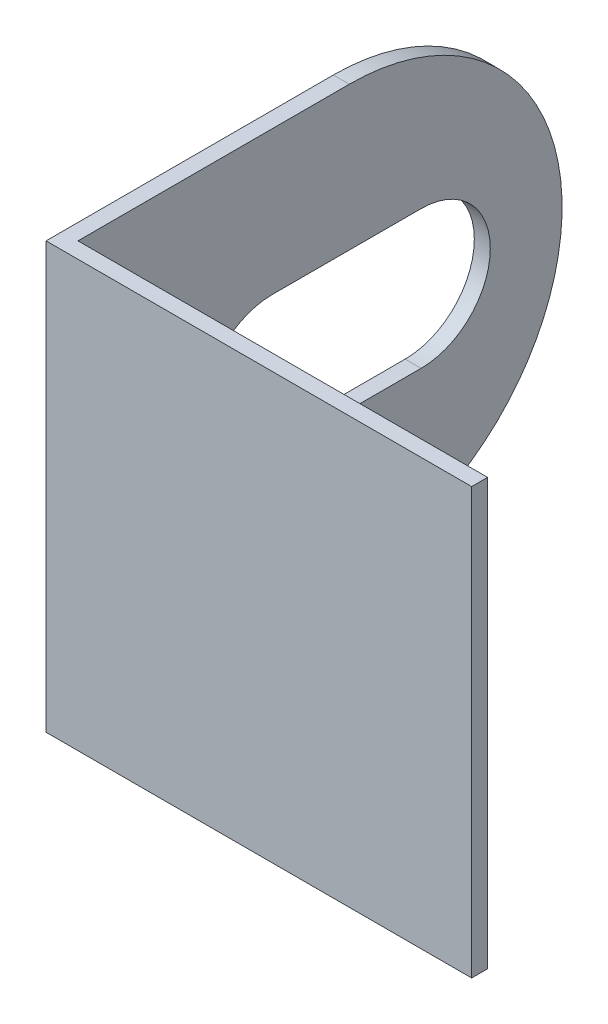
ISO-10303-21;
HEADER;
FILE_DESCRIPTION(('STEP AP214'),'2;1');
FILE_NAME('part.step','',(''),(''),'','','');
FILE_SCHEMA(('AUTOMOTIVE_DESIGN { 1 0 10303 214 1 1 1 1 }'));
ENDSEC;
DATA;
#1=APPLICATION_CONTEXT('core data for automotive mechanical design processes');
#2=APPLICATION_PROTOCOL_DEFINITION('international standard','automotive_design',2000,#1);
#3=PRODUCT_CONTEXT('',#1,'mechanical');
#4=PRODUCT('Part','Part','',(#3));
#5=PRODUCT_RELATED_PRODUCT_CATEGORY('part','',(#4));
#6=PRODUCT_DEFINITION_FORMATION('','',#4);
#7=PRODUCT_DEFINITION_CONTEXT('part definition',#1,'design');
#8=PRODUCT_DEFINITION('design','',#6,#7);
#9=PRODUCT_DEFINITION_SHAPE('','',#8);
#10=(LENGTH_UNIT() NAMED_UNIT(*) SI_UNIT(.MILLI.,.METRE.));
#11=(NAMED_UNIT(*) PLANE_ANGLE_UNIT() SI_UNIT($,.RADIAN.));
#12=(NAMED_UNIT(*) SI_UNIT($,.STERADIAN.) SOLID_ANGLE_UNIT());
#13=UNCERTAINTY_MEASURE_WITH_UNIT(LENGTH_MEASURE(1.E-05),#10,'distance_accuracy_value','');
#14=(GEOMETRIC_REPRESENTATION_CONTEXT(3) GLOBAL_UNCERTAINTY_ASSIGNED_CONTEXT((#13)) GLOBAL_UNIT_ASSIGNED_CONTEXT((#10,
#11,#12)) REPRESENTATION_CONTEXT('',''));
#15=CARTESIAN_POINT('',(0.,0.,0.));
#16=DIRECTION('',(0.,0.,1.));
#17=DIRECTION('',(1.,0.,0.));
#18=AXIS2_PLACEMENT_3D('',#15,#16,#17);
#19=CARTESIAN_POINT('',(-20.,40.,23.5));
#20=DIRECTION('',(1.,0.,0.));
#21=DIRECTION('',(0.,0.,-1.));
#22=AXIS2_PLACEMENT_3D('',#19,#20,#21);
#23=PLANE('',#22);
#24=CARTESIAN_POINT('',(-20.,20.,3.75));
#25=DIRECTION('',(-1.,0.,0.));
#26=DIRECTION('',(0.,0.,1.));
#27=AXIS2_PLACEMENT_3D('',#24,#25,#26);
#28=CIRCLE('',#27,6.5);
#29=CARTESIAN_POINT('',(-20.,13.5,3.75));
#30=VERTEX_POINT('',#29);
#31=CARTESIAN_POINT('',(-20.,26.5,3.75));
#32=VERTEX_POINT('',#31);
#33=EDGE_CURVE('E195',#30,#32,#28,.T.);
#34=ORIENTED_EDGE('',*,*,#33,.F.);
#35=DIRECTION('',(0.,0.,1.));
#36=VECTOR('',#35,1.);
#37=CARTESIAN_POINT('',(-20.,13.5,0.));
#38=LINE('',#37,#36);
#39=CARTESIAN_POINT('',(-20.,13.5,-10.25));
#40=VERTEX_POINT('',#39);
#41=EDGE_CURVE('E120',#40,#30,#38,.T.);
#42=ORIENTED_EDGE('',*,*,#41,.F.);
#43=CARTESIAN_POINT('',(-20.,20.,-10.25));
#44=DIRECTION('',(-1.,0.,0.));
#45=DIRECTION('',(0.,0.,1.));
#46=AXIS2_PLACEMENT_3D('',#43,#44,#45);
#47=CIRCLE('',#46,6.5);
#48=CARTESIAN_POINT('',(-20.,26.5,-10.25));
#49=VERTEX_POINT('',#48);
#50=EDGE_CURVE('E202',#49,#40,#47,.T.);
#51=ORIENTED_EDGE('',*,*,#50,.F.);
#52=DIRECTION('',(0.,0.,1.));
#53=VECTOR('',#52,1.);
#54=CARTESIAN_POINT('',(-20.,26.5,0.));
#55=LINE('',#54,#53);
#56=EDGE_CURVE('E185',#49,#32,#55,.T.);
#57=ORIENTED_EDGE('',*,*,#56,.T.);
#58=EDGE_LOOP('',(#34,#42,#51,#57));
#59=FACE_BOUND('',#58,.T.);
#60=DIRECTION('',(0.,0.,1.));
#61=VECTOR('',#60,1.);
#62=CARTESIAN_POINT('',(-20.,40.,23.5));
#63=LINE('',#62,#61);
#64=CARTESIAN_POINT('',(-20.,40.,-3.5));
#65=VERTEX_POINT('',#64);
#66=CARTESIAN_POINT('',(-20.,40.,23.5));
#67=VERTEX_POINT('',#66);
#68=EDGE_CURVE('E224',#65,#67,#63,.T.);
#69=ORIENTED_EDGE('',*,*,#68,.F.);
#70=CARTESIAN_POINT('',(-20.,20.,-3.5));
#71=DIRECTION('',(-1.,0.,0.));
#72=DIRECTION('',(0.,0.,1.));
#73=AXIS2_PLACEMENT_3D('',#70,#71,#72);
#74=CIRCLE('',#73,20.);
#75=CARTESIAN_POINT('',(-20.,0.,-3.5));
#76=VERTEX_POINT('',#75);
#77=EDGE_CURVE('E212',#65,#76,#74,.T.);
#78=ORIENTED_EDGE('',*,*,#77,.T.);
#79=DIRECTION('',(0.,0.,1.));
#80=VECTOR('',#79,1.);
#81=CARTESIAN_POINT('',(-20.,0.,23.5));
#82=LINE('',#81,#80);
#83=CARTESIAN_POINT('',(-20.,0.,23.5));
#84=VERTEX_POINT('',#83);
#85=EDGE_CURVE('E223',#76,#84,#82,.T.);
#86=ORIENTED_EDGE('',*,*,#85,.T.);
#87=DIRECTION('',(0.,-1.,0.));
#88=VECTOR('',#87,1.);
#89=CARTESIAN_POINT('',(-20.,40.,23.5));
#90=LINE('',#89,#88);
#91=EDGE_CURVE('E267',#67,#84,#90,.T.);
#92=ORIENTED_EDGE('',*,*,#91,.F.);
#93=EDGE_LOOP('',(#69,#78,#86,#92));
#94=FACE_BOUND('',#93,.T.);
#95=ADVANCED_FACE('F105',(#59,#94),#23,.F.);
#96=CARTESIAN_POINT('',(-18.5,40.,-23.5));
#97=DIRECTION('',(-1.,0.,0.));
#98=DIRECTION('',(0.,0.,1.));
#99=AXIS2_PLACEMENT_3D('',#96,#97,#98);
#100=PLANE('',#99);
#101=CARTESIAN_POINT('',(-18.5,20.,-10.25));
#102=DIRECTION('',(-1.,0.,0.));
#103=DIRECTION('',(0.,0.,1.));
#104=AXIS2_PLACEMENT_3D('',#101,#102,#103);
#105=CIRCLE('',#104,6.5);
#106=CARTESIAN_POINT('',(-18.5,26.5,-10.25));
#107=VERTEX_POINT('',#106);
#108=CARTESIAN_POINT('',(-18.5,13.5,-10.25));
#109=VERTEX_POINT('',#108);
#110=EDGE_CURVE('E113',#107,#109,#105,.T.);
#111=ORIENTED_EDGE('',*,*,#110,.T.);
#112=DIRECTION('',(0.,0.,1.));
#113=VECTOR('',#112,1.);
#114=CARTESIAN_POINT('',(-18.5,13.5,-23.5));
#115=LINE('',#114,#113);
#116=CARTESIAN_POINT('',(-18.5,13.5,3.75));
#117=VERTEX_POINT('',#116);
#118=EDGE_CURVE('E12',#109,#117,#115,.T.);
#119=ORIENTED_EDGE('',*,*,#118,.T.);
#120=CARTESIAN_POINT('',(-18.5,20.,3.75));
#121=DIRECTION('',(-1.,0.,0.));
#122=DIRECTION('',(0.,0.,1.));
#123=AXIS2_PLACEMENT_3D('',#120,#121,#122);
#124=CIRCLE('',#123,6.5);
#125=CARTESIAN_POINT('',(-18.5,26.5,3.75));
#126=VERTEX_POINT('',#125);
#127=EDGE_CURVE('E278',#117,#126,#124,.T.);
#128=ORIENTED_EDGE('',*,*,#127,.T.);
#129=DIRECTION('',(0.,0.,1.));
#130=VECTOR('',#129,1.);
#131=CARTESIAN_POINT('',(-18.5,26.5,-23.5));
#132=LINE('',#131,#130);
#133=EDGE_CURVE('E188',#107,#126,#132,.T.);
#134=ORIENTED_EDGE('',*,*,#133,.F.);
#135=EDGE_LOOP('',(#111,#119,#128,#134));
#136=FACE_BOUND('',#135,.T.);
#137=CARTESIAN_POINT('',(-18.5,20.,-3.5));
#138=DIRECTION('',(-1.,0.,0.));
#139=DIRECTION('',(0.,0.,1.));
#140=AXIS2_PLACEMENT_3D('',#137,#138,#139);
#141=CIRCLE('',#140,20.);
#142=CARTESIAN_POINT('',(-18.5,40.,-3.5));
#143=VERTEX_POINT('',#142);
#144=CARTESIAN_POINT('',(-18.5,0.,-3.5));
#145=VERTEX_POINT('',#144);
#146=EDGE_CURVE('E220',#143,#145,#141,.T.);
#147=ORIENTED_EDGE('',*,*,#146,.F.);
#148=DIRECTION('',(0.,0.,-1.));
#149=VECTOR('',#148,1.);
#150=CARTESIAN_POINT('',(-18.5,40.,-23.5));
#151=LINE('',#150,#149);
#152=CARTESIAN_POINT('',(-18.5,40.,22.));
#153=VERTEX_POINT('',#152);
#154=EDGE_CURVE('E237',#153,#143,#151,.T.);
#155=ORIENTED_EDGE('',*,*,#154,.F.);
#156=DIRECTION('',(0.,-1.,0.));
#157=VECTOR('',#156,1.);
#158=CARTESIAN_POINT('',(-18.5,40.,22.));
#159=LINE('',#158,#157);
#160=CARTESIAN_POINT('',(-18.5,0.,22.));
#161=VERTEX_POINT('',#160);
#162=EDGE_CURVE('E241',#153,#161,#159,.T.);
#163=ORIENTED_EDGE('',*,*,#162,.T.);
#164=DIRECTION('',(0.,0.,-1.));
#165=VECTOR('',#164,1.);
#166=CARTESIAN_POINT('',(-18.5,0.,-23.5));
#167=LINE('',#166,#165);
#168=EDGE_CURVE('E228',#161,#145,#167,.T.);
#169=ORIENTED_EDGE('',*,*,#168,.T.);
#170=EDGE_LOOP('',(#147,#155,#163,#169));
#171=FACE_BOUND('',#170,.T.);
#172=ADVANCED_FACE('F285',(#136,#171),#100,.F.);
#173=CARTESIAN_POINT('',(20.,40.,23.5));
#174=DIRECTION('',(0.,0.,-1.));
#175=DIRECTION('',(-1.,0.,0.));
#176=AXIS2_PLACEMENT_3D('',#173,#174,#175);
#177=PLANE('',#176);
#178=DIRECTION('',(1.,0.,0.));
#179=VECTOR('',#178,1.);
#180=CARTESIAN_POINT('',(20.,0.,23.5));
#181=LINE('',#180,#179);
#182=CARTESIAN_POINT('',(20.,0.,23.5));
#183=VERTEX_POINT('',#182);
#184=EDGE_CURVE('E244',#84,#183,#181,.T.);
#185=ORIENTED_EDGE('',*,*,#184,.T.);
#186=DIRECTION('',(0.,-1.,0.));
#187=VECTOR('',#186,1.);
#188=CARTESIAN_POINT('',(20.,40.,23.5));
#189=LINE('',#188,#187);
#190=CARTESIAN_POINT('',(20.,40.,23.5));
#191=VERTEX_POINT('',#190);
#192=EDGE_CURVE('E263',#191,#183,#189,.T.);
#193=ORIENTED_EDGE('',*,*,#192,.F.);
#194=DIRECTION('',(1.,0.,0.));
#195=VECTOR('',#194,1.);
#196=CARTESIAN_POINT('',(20.,40.,23.5));
#197=LINE('',#196,#195);
#198=EDGE_CURVE('E227',#67,#191,#197,.T.);
#199=ORIENTED_EDGE('',*,*,#198,.F.);
#200=ORIENTED_EDGE('',*,*,#91,.T.);
#201=EDGE_LOOP('',(#185,#193,#199,#200));
#202=FACE_BOUND('',#201,.T.);
#203=ADVANCED_FACE('F308',(#202),#177,.F.);
#204=CARTESIAN_POINT('',(20.,40.,22.));
#205=DIRECTION('',(-1.,0.,0.));
#206=DIRECTION('',(0.,0.,1.));
#207=AXIS2_PLACEMENT_3D('',#204,#205,#206);
#208=PLANE('',#207);
#209=DIRECTION('',(0.,0.,-1.));
#210=VECTOR('',#209,1.);
#211=CARTESIAN_POINT('',(20.,0.,22.));
#212=LINE('',#211,#210);
#213=CARTESIAN_POINT('',(20.,0.,22.));
#214=VERTEX_POINT('',#213);
#215=EDGE_CURVE('E247',#183,#214,#212,.T.);
#216=ORIENTED_EDGE('',*,*,#215,.T.);
#217=DIRECTION('',(0.,-1.,0.));
#218=VECTOR('',#217,1.);
#219=CARTESIAN_POINT('',(20.,40.,22.));
#220=LINE('',#219,#218);
#221=CARTESIAN_POINT('',(20.,40.,22.));
#222=VERTEX_POINT('',#221);
#223=EDGE_CURVE('E259',#222,#214,#220,.T.);
#224=ORIENTED_EDGE('',*,*,#223,.F.);
#225=DIRECTION('',(0.,0.,-1.));
#226=VECTOR('',#225,1.);
#227=CARTESIAN_POINT('',(20.,40.,22.));
#228=LINE('',#227,#226);
#229=EDGE_CURVE('E231',#191,#222,#228,.T.);
#230=ORIENTED_EDGE('',*,*,#229,.F.);
#231=ORIENTED_EDGE('',*,*,#192,.T.);
#232=EDGE_LOOP('',(#216,#224,#230,#231));
#233=FACE_BOUND('',#232,.T.);
#234=ADVANCED_FACE('F314',(#233),#208,.F.);
#235=CARTESIAN_POINT('',(-18.5,40.,22.));
#236=DIRECTION('',(0.,0.,1.));
#237=DIRECTION('',(1.,0.,0.));
#238=AXIS2_PLACEMENT_3D('',#235,#236,#237);
#239=PLANE('',#238);
#240=DIRECTION('',(-1.,0.,0.));
#241=VECTOR('',#240,1.);
#242=CARTESIAN_POINT('',(-18.5,0.,22.));
#243=LINE('',#242,#241);
#244=EDGE_CURVE('E250',#214,#161,#243,.T.);
#245=ORIENTED_EDGE('',*,*,#244,.T.);
#246=ORIENTED_EDGE('',*,*,#162,.F.);
#247=DIRECTION('',(-1.,0.,0.));
#248=VECTOR('',#247,1.);
#249=CARTESIAN_POINT('',(-18.5,40.,22.));
#250=LINE('',#249,#248);
#251=EDGE_CURVE('E234',#222,#153,#250,.T.);
#252=ORIENTED_EDGE('',*,*,#251,.F.);
#253=ORIENTED_EDGE('',*,*,#223,.T.);
#254=EDGE_LOOP('',(#245,#246,#252,#253));
#255=FACE_BOUND('',#254,.T.);
#256=ADVANCED_FACE('F319',(#255),#239,.F.);
#257=CARTESIAN_POINT('',(0.,40.,0.));
#258=DIRECTION('',(0.,-1.,0.));
#259=DIRECTION('',(0.,0.,-1.));
#260=AXIS2_PLACEMENT_3D('',#257,#258,#259);
#261=PLANE('',#260);
#262=ORIENTED_EDGE('',*,*,#154,.T.);
#263=DIRECTION('',(-1.,0.,0.));
#264=VECTOR('',#263,1.);
#265=CARTESIAN_POINT('',(20.,40.,-3.5));
#266=LINE('',#265,#264);
#267=EDGE_CURVE('E274',#143,#65,#266,.T.);
#268=ORIENTED_EDGE('',*,*,#267,.T.);
#269=ORIENTED_EDGE('',*,*,#68,.T.);
#270=ORIENTED_EDGE('',*,*,#198,.T.);
#271=ORIENTED_EDGE('',*,*,#229,.T.);
#272=ORIENTED_EDGE('',*,*,#251,.T.);
#273=EDGE_LOOP('',(#262,#268,#269,#270,#271,#272));
#274=FACE_BOUND('',#273,.T.);
#275=ADVANCED_FACE('F321',(#274),#261,.F.);
#276=CARTESIAN_POINT('',(0.,0.,0.));
#277=DIRECTION('',(0.,-1.,0.));
#278=DIRECTION('',(0.,0.,-1.));
#279=AXIS2_PLACEMENT_3D('',#276,#277,#278);
#280=PLANE('',#279);
#281=DIRECTION('',(-1.,0.,0.));
#282=VECTOR('',#281,1.);
#283=CARTESIAN_POINT('',(20.,0.,-3.5));
#284=LINE('',#283,#282);
#285=EDGE_CURVE('E271',#145,#76,#284,.T.);
#286=ORIENTED_EDGE('',*,*,#285,.F.);
#287=ORIENTED_EDGE('',*,*,#168,.F.);
#288=ORIENTED_EDGE('',*,*,#244,.F.);
#289=ORIENTED_EDGE('',*,*,#215,.F.);
#290=ORIENTED_EDGE('',*,*,#184,.F.);
#291=ORIENTED_EDGE('',*,*,#85,.F.);
#292=EDGE_LOOP('',(#286,#287,#288,#289,#290,#291));
#293=FACE_BOUND('',#292,.T.);
#294=ADVANCED_FACE('F299',(#293),#280,.T.);
#295=CARTESIAN_POINT('',(20.,20.,-3.5));
#296=DIRECTION('',(-1.,0.,0.));
#297=DIRECTION('',(0.,0.,1.));
#298=AXIS2_PLACEMENT_3D('',#295,#296,#297);
#299=CYLINDRICAL_SURFACE('',#298,20.);
#300=ORIENTED_EDGE('',*,*,#146,.T.);
#301=ORIENTED_EDGE('',*,*,#285,.T.);
#302=ORIENTED_EDGE('',*,*,#77,.F.);
#303=ORIENTED_EDGE('',*,*,#267,.F.);
#304=EDGE_LOOP('',(#300,#301,#302,#303));
#305=FACE_BOUND('',#304,.T.);
#306=ADVANCED_FACE('F292',(#305),#299,.T.);
#307=CARTESIAN_POINT('',(20.,13.5,0.));
#308=DIRECTION('',(0.,-1.,0.));
#309=DIRECTION('',(0.,0.,-1.));
#310=AXIS2_PLACEMENT_3D('',#307,#308,#309);
#311=PLANE('',#310);
#312=DIRECTION('',(-1.,0.,0.));
#313=VECTOR('',#312,1.);
#314=CARTESIAN_POINT('',(20.,13.5,-10.25));
#315=LINE('',#314,#313);
#316=EDGE_CURVE('E209',#109,#40,#315,.T.);
#317=ORIENTED_EDGE('',*,*,#316,.T.);
#318=ORIENTED_EDGE('',*,*,#41,.T.);
#319=DIRECTION('',(-1.,0.,0.));
#320=VECTOR('',#319,1.);
#321=CARTESIAN_POINT('',(20.,13.5,3.75));
#322=LINE('',#321,#320);
#323=EDGE_CURVE('E192',#117,#30,#322,.T.);
#324=ORIENTED_EDGE('',*,*,#323,.F.);
#325=ORIENTED_EDGE('',*,*,#118,.F.);
#326=EDGE_LOOP('',(#317,#318,#324,#325));
#327=FACE_BOUND('',#326,.T.);
#328=ADVANCED_FACE('F290',(#327),#311,.F.);
#329=CARTESIAN_POINT('',(20.,20.,-10.25));
#330=DIRECTION('',(-1.,0.,0.));
#331=DIRECTION('',(0.,0.,1.));
#332=AXIS2_PLACEMENT_3D('',#329,#330,#331);
#333=CYLINDRICAL_SURFACE('',#332,6.5);
#334=DIRECTION('',(-1.,0.,0.));
#335=VECTOR('',#334,1.);
#336=CARTESIAN_POINT('',(20.,26.5,-10.25));
#337=LINE('',#336,#335);
#338=EDGE_CURVE('E191',#107,#49,#337,.T.);
#339=ORIENTED_EDGE('',*,*,#338,.T.);
#340=ORIENTED_EDGE('',*,*,#50,.T.);
#341=ORIENTED_EDGE('',*,*,#316,.F.);
#342=ORIENTED_EDGE('',*,*,#110,.F.);
#343=EDGE_LOOP('',(#339,#340,#341,#342));
#344=FACE_BOUND('',#343,.T.);
#345=ADVANCED_FACE('F289',(#344),#333,.F.);
#346=CARTESIAN_POINT('',(20.,26.5,0.));
#347=DIRECTION('',(0.,-1.,0.));
#348=DIRECTION('',(0.,0.,-1.));
#349=AXIS2_PLACEMENT_3D('',#346,#347,#348);
#350=PLANE('',#349);
#351=ORIENTED_EDGE('',*,*,#133,.T.);
#352=DIRECTION('',(-1.,0.,0.));
#353=VECTOR('',#352,1.);
#354=CARTESIAN_POINT('',(20.,26.5,3.75));
#355=LINE('',#354,#353);
#356=EDGE_CURVE('E128',#126,#32,#355,.T.);
#357=ORIENTED_EDGE('',*,*,#356,.T.);
#358=ORIENTED_EDGE('',*,*,#56,.F.);
#359=ORIENTED_EDGE('',*,*,#338,.F.);
#360=EDGE_LOOP('',(#351,#357,#358,#359));
#361=FACE_BOUND('',#360,.T.);
#362=ADVANCED_FACE('F182',(#361),#350,.T.);
#363=CARTESIAN_POINT('',(20.,20.,3.75));
#364=DIRECTION('',(-1.,0.,0.));
#365=DIRECTION('',(0.,0.,1.));
#366=AXIS2_PLACEMENT_3D('',#363,#364,#365);
#367=CYLINDRICAL_SURFACE('',#366,6.5);
#368=ORIENTED_EDGE('',*,*,#323,.T.);
#369=ORIENTED_EDGE('',*,*,#33,.T.);
#370=ORIENTED_EDGE('',*,*,#356,.F.);
#371=ORIENTED_EDGE('',*,*,#127,.F.);
#372=EDGE_LOOP('',(#368,#369,#370,#371));
#373=FACE_BOUND('',#372,.T.);
#374=ADVANCED_FACE('F196',(#373),#367,.F.);
#375=CLOSED_SHELL('',(#95,#172,#203,#234,#256,#275,#294,#306,#328,#345,#362,#374));
#376=MANIFOLD_SOLID_BREP('B2',#375);
#377=ADVANCED_BREP_SHAPE_REPRESENTATION('',(#18,#376),#14);
#378=SHAPE_DEFINITION_REPRESENTATION(#9,#377);
ENDSEC;
END-ISO-10303-21;
